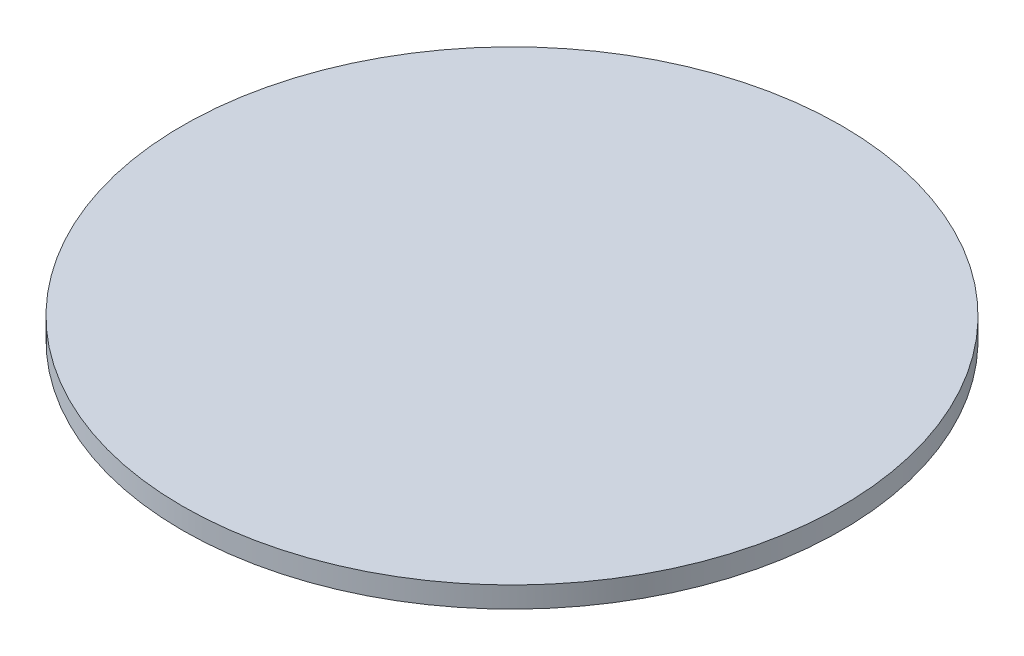
ISO-10303-21;
HEADER;
FILE_DESCRIPTION(('STEP AP214'),'2;1');
FILE_NAME('part.step','',(''),(''),'','','');
FILE_SCHEMA(('AUTOMOTIVE_DESIGN { 1 0 10303 214 1 1 1 1 }'));
ENDSEC;
DATA;
#1=APPLICATION_CONTEXT('core data for automotive mechanical design processes');
#2=APPLICATION_PROTOCOL_DEFINITION('international standard','automotive_design',2000,#1);
#3=PRODUCT_CONTEXT('',#1,'mechanical');
#4=PRODUCT('Part','Part','',(#3));
#5=PRODUCT_RELATED_PRODUCT_CATEGORY('part','',(#4));
#6=PRODUCT_DEFINITION_FORMATION('','',#4);
#7=PRODUCT_DEFINITION_CONTEXT('part definition',#1,'design');
#8=PRODUCT_DEFINITION('design','',#6,#7);
#9=PRODUCT_DEFINITION_SHAPE('','',#8);
#10=(LENGTH_UNIT() NAMED_UNIT(*) SI_UNIT(.MILLI.,.METRE.));
#11=(NAMED_UNIT(*) PLANE_ANGLE_UNIT() SI_UNIT($,.RADIAN.));
#12=(NAMED_UNIT(*) SI_UNIT($,.STERADIAN.) SOLID_ANGLE_UNIT());
#13=UNCERTAINTY_MEASURE_WITH_UNIT(LENGTH_MEASURE(1.E-05),#10,'distance_accuracy_value','');
#14=(GEOMETRIC_REPRESENTATION_CONTEXT(3) GLOBAL_UNCERTAINTY_ASSIGNED_CONTEXT((#13)) GLOBAL_UNIT_ASSIGNED_CONTEXT((#10,
#11,#12)) REPRESENTATION_CONTEXT('',''));
#15=CARTESIAN_POINT('',(0.,0.,0.));
#16=DIRECTION('',(0.,0.,1.));
#17=DIRECTION('',(1.,0.,0.));
#18=AXIS2_PLACEMENT_3D('',#15,#16,#17);
#19=CARTESIAN_POINT('',(0.,1.,0.));
#20=DIRECTION('',(0.,-1.,0.));
#21=DIRECTION('',(0.,0.,-1.));
#22=AXIS2_PLACEMENT_3D('',#19,#20,#21);
#23=CYLINDRICAL_SURFACE('',#22,15.75);
#24=CARTESIAN_POINT('',(0.,1.,0.));
#25=DIRECTION('',(0.,1.,0.));
#26=DIRECTION('',(0.,0.,1.));
#27=AXIS2_PLACEMENT_3D('',#24,#25,#26);
#28=CIRCLE('',#27,15.75);
#29=CARTESIAN_POINT('',(0.,1.,15.75));
#30=VERTEX_POINT('',#29);
#31=EDGE_CURVE('E10',#30,#30,#28,.T.);
#32=ORIENTED_EDGE('',*,*,#31,.F.);
#33=EDGE_LOOP('',(#32));
#34=FACE_BOUND('',#33,.T.);
#35=CARTESIAN_POINT('',(0.,0.,0.));
#36=DIRECTION('',(0.,1.,0.));
#37=DIRECTION('',(0.,0.,1.));
#38=AXIS2_PLACEMENT_3D('',#35,#36,#37);
#39=CIRCLE('',#38,15.75);
#40=CARTESIAN_POINT('',(0.,0.,15.75));
#41=VERTEX_POINT('',#40);
#42=EDGE_CURVE('E35',#41,#41,#39,.T.);
#43=ORIENTED_EDGE('',*,*,#42,.T.);
#44=EDGE_LOOP('',(#43));
#45=FACE_BOUND('',#44,.T.);
#46=ADVANCED_FACE('F32',(#34,#45),#23,.T.);
#47=CARTESIAN_POINT('',(0.,1.,0.));
#48=DIRECTION('',(0.,1.,0.));
#49=DIRECTION('',(0.,0.,1.));
#50=AXIS2_PLACEMENT_3D('',#47,#48,#49);
#51=PLANE('',#50);
#52=ORIENTED_EDGE('',*,*,#31,.T.);
#53=EDGE_LOOP('',(#52));
#54=FACE_BOUND('',#53,.T.);
#55=ADVANCED_FACE('F47',(#54),#51,.T.);
#56=CARTESIAN_POINT('',(0.,0.,0.));
#57=DIRECTION('',(0.,1.,0.));
#58=DIRECTION('',(0.,0.,1.));
#59=AXIS2_PLACEMENT_3D('',#56,#57,#58);
#60=PLANE('',#59);
#61=ORIENTED_EDGE('',*,*,#42,.F.);
#62=EDGE_LOOP('',(#61));
#63=FACE_BOUND('',#62,.T.);
#64=ADVANCED_FACE('F45',(#63),#60,.F.);
#65=CLOSED_SHELL('',(#46,#55,#64));
#66=MANIFOLD_SOLID_BREP('B2',#65);
#67=ADVANCED_BREP_SHAPE_REPRESENTATION('',(#18,#66),#14);
#68=SHAPE_DEFINITION_REPRESENTATION(#9,#67);
ENDSEC;
END-ISO-10303-21;
